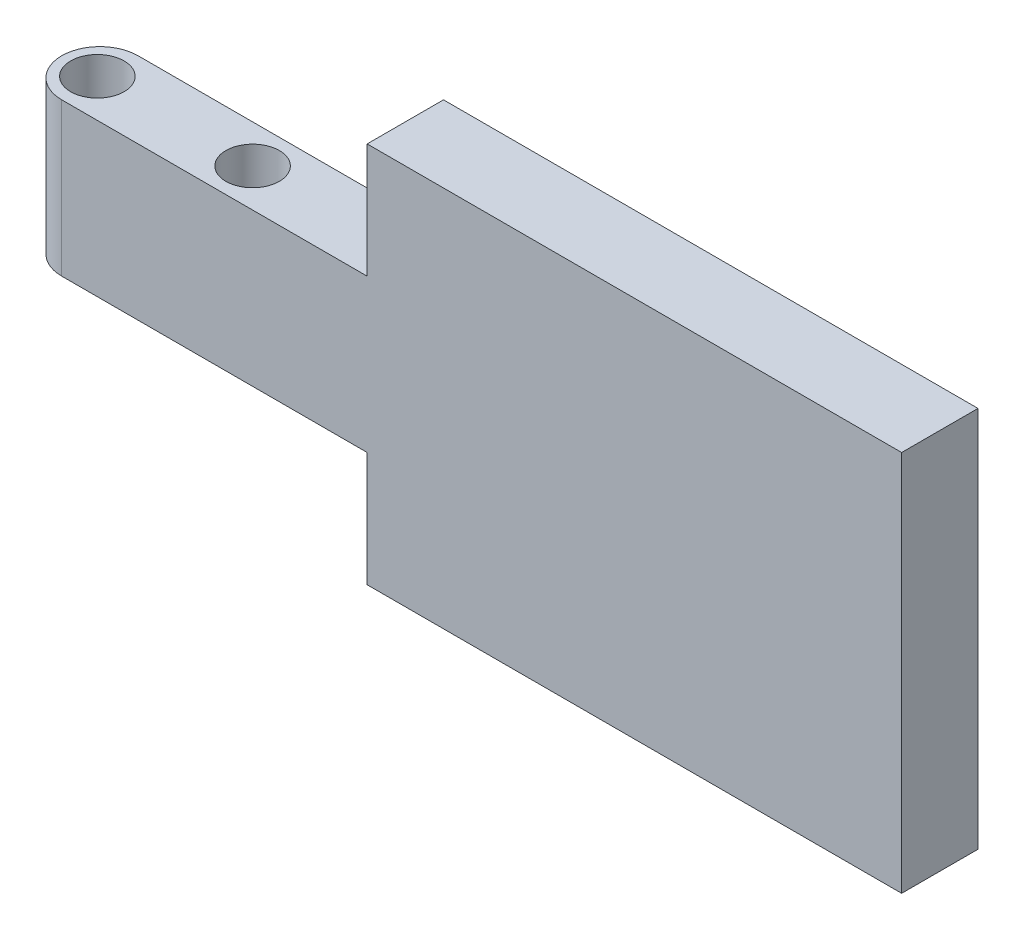
ISO-10303-21;
HEADER;
FILE_DESCRIPTION(('STEP AP214'),'2;1');
FILE_NAME('part.step','',(''),(''),'','','');
FILE_SCHEMA(('AUTOMOTIVE_DESIGN { 1 0 10303 214 1 1 1 1 }'));
ENDSEC;
DATA;
#1=APPLICATION_CONTEXT('core data for automotive mechanical design processes');
#2=APPLICATION_PROTOCOL_DEFINITION('international standard','automotive_design',2000,#1);
#3=PRODUCT_CONTEXT('',#1,'mechanical');
#4=PRODUCT('Part','Part','',(#3));
#5=PRODUCT_RELATED_PRODUCT_CATEGORY('part','',(#4));
#6=PRODUCT_DEFINITION_FORMATION('','',#4);
#7=PRODUCT_DEFINITION_CONTEXT('part definition',#1,'design');
#8=PRODUCT_DEFINITION('design','',#6,#7);
#9=PRODUCT_DEFINITION_SHAPE('','',#8);
#10=(LENGTH_UNIT() NAMED_UNIT(*) SI_UNIT(.MILLI.,.METRE.));
#11=(NAMED_UNIT(*) PLANE_ANGLE_UNIT() SI_UNIT($,.RADIAN.));
#12=(NAMED_UNIT(*) SI_UNIT($,.STERADIAN.) SOLID_ANGLE_UNIT());
#13=UNCERTAINTY_MEASURE_WITH_UNIT(LENGTH_MEASURE(1.E-05),#10,'distance_accuracy_value','');
#14=(GEOMETRIC_REPRESENTATION_CONTEXT(3) GLOBAL_UNCERTAINTY_ASSIGNED_CONTEXT((#13)) GLOBAL_UNIT_ASSIGNED_CONTEXT((#10,
#11,#12)) REPRESENTATION_CONTEXT('',''));
#15=CARTESIAN_POINT('',(0.,0.,0.));
#16=DIRECTION('',(0.,0.,1.));
#17=DIRECTION('',(1.,0.,0.));
#18=AXIS2_PLACEMENT_3D('',#15,#16,#17);
#19=CARTESIAN_POINT('',(-35.,-25.,5.));
#20=DIRECTION('',(1.,0.,0.));
#21=DIRECTION('',(0.,0.,-1.));
#22=AXIS2_PLACEMENT_3D('',#19,#20,#21);
#23=PLANE('',#22);
#24=DIRECTION('',(0.,0.,-1.));
#25=VECTOR('',#24,1.);
#26=CARTESIAN_POINT('',(-35.,10.,-5.));
#27=LINE('',#26,#25);
#28=CARTESIAN_POINT('',(-35.,10.,5.));
#29=VERTEX_POINT('',#28);
#30=CARTESIAN_POINT('',(-35.,10.,-5.));
#31=VERTEX_POINT('',#30);
#32=EDGE_CURVE('E119',#29,#31,#27,.T.);
#33=ORIENTED_EDGE('',*,*,#32,.F.);
#34=DIRECTION('',(0.,1.,0.));
#35=VECTOR('',#34,1.);
#36=CARTESIAN_POINT('',(-35.,-25.,5.));
#37=LINE('',#36,#35);
#38=CARTESIAN_POINT('',(-35.,25.,5.));
#39=VERTEX_POINT('',#38);
#40=EDGE_CURVE('E116',#29,#39,#37,.T.);
#41=ORIENTED_EDGE('',*,*,#40,.T.);
#42=DIRECTION('',(0.,0.,-1.));
#43=VECTOR('',#42,1.);
#44=CARTESIAN_POINT('',(-35.,25.,5.));
#45=LINE('',#44,#43);
#46=CARTESIAN_POINT('',(-35.,25.,-5.));
#47=VERTEX_POINT('',#46);
#48=EDGE_CURVE('E149',#39,#47,#45,.T.);
#49=ORIENTED_EDGE('',*,*,#48,.T.);
#50=DIRECTION('',(0.,1.,0.));
#51=VECTOR('',#50,1.);
#52=CARTESIAN_POINT('',(-35.,-25.,-5.));
#53=LINE('',#52,#51);
#54=EDGE_CURVE('E161',#31,#47,#53,.T.);
#55=ORIENTED_EDGE('',*,*,#54,.F.);
#56=EDGE_LOOP('',(#33,#41,#49,#55));
#57=FACE_BOUND('',#56,.T.);
#58=ADVANCED_FACE('F33',(#57),#23,.F.);
#59=CARTESIAN_POINT('',(-35.,-25.,-5.));
#60=DIRECTION('',(0.,0.,1.));
#61=DIRECTION('',(1.,0.,0.));
#62=AXIS2_PLACEMENT_3D('',#59,#60,#61);
#63=PLANE('',#62);
#64=CARTESIAN_POINT('',(-35.,-25.,-5.));
#65=VERTEX_POINT('',#64);
#66=CARTESIAN_POINT('',(-35.,-10.,-5.));
#67=VERTEX_POINT('',#66);
#68=EDGE_CURVE('E162',#65,#67,#53,.T.);
#69=ORIENTED_EDGE('',*,*,#68,.T.);
#70=DIRECTION('',(-1.,0.,0.));
#71=VECTOR('',#70,1.);
#72=CARTESIAN_POINT('',(-75.,-10.,-5.));
#73=LINE('',#72,#71);
#74=CARTESIAN_POINT('',(-75.,-10.,-5.));
#75=VERTEX_POINT('',#74);
#76=EDGE_CURVE('E50',#67,#75,#73,.T.);
#77=ORIENTED_EDGE('',*,*,#76,.T.);
#78=DIRECTION('',(0.,1.,0.));
#79=VECTOR('',#78,1.);
#80=CARTESIAN_POINT('',(-75.,-10.,-5.));
#81=LINE('',#80,#79);
#82=CARTESIAN_POINT('',(-75.,10.,-5.));
#83=VERTEX_POINT('',#82);
#84=EDGE_CURVE('E110',#75,#83,#81,.T.);
#85=ORIENTED_EDGE('',*,*,#84,.T.);
#86=DIRECTION('',(-1.,0.,0.));
#87=VECTOR('',#86,1.);
#88=CARTESIAN_POINT('',(-75.,10.,-5.));
#89=LINE('',#88,#87);
#90=EDGE_CURVE('E124',#31,#83,#89,.T.);
#91=ORIENTED_EDGE('',*,*,#90,.F.);
#92=ORIENTED_EDGE('',*,*,#54,.T.);
#93=DIRECTION('',(1.,0.,0.));
#94=VECTOR('',#93,1.);
#95=CARTESIAN_POINT('',(-35.,25.,-5.));
#96=LINE('',#95,#94);
#97=CARTESIAN_POINT('',(35.,25.,-5.));
#98=VERTEX_POINT('',#97);
#99=EDGE_CURVE('E139',#47,#98,#96,.T.);
#100=ORIENTED_EDGE('',*,*,#99,.T.);
#101=DIRECTION('',(0.,1.,0.));
#102=VECTOR('',#101,1.);
#103=CARTESIAN_POINT('',(35.,-25.,-5.));
#104=LINE('',#103,#102);
#105=CARTESIAN_POINT('',(35.,-25.,-5.));
#106=VERTEX_POINT('',#105);
#107=EDGE_CURVE('E11',#106,#98,#104,.T.);
#108=ORIENTED_EDGE('',*,*,#107,.F.);
#109=DIRECTION('',(1.,0.,0.));
#110=VECTOR('',#109,1.);
#111=CARTESIAN_POINT('',(-35.,-25.,-5.));
#112=LINE('',#111,#110);
#113=EDGE_CURVE('E152',#65,#106,#112,.T.);
#114=ORIENTED_EDGE('',*,*,#113,.F.);
#115=EDGE_LOOP('',(#69,#77,#85,#91,#92,#100,#108,#114));
#116=FACE_BOUND('',#115,.T.);
#117=ADVANCED_FACE('F35',(#116),#63,.F.);
#118=CARTESIAN_POINT('',(35.,-25.,5.));
#119=DIRECTION('',(1.,0.,0.));
#120=DIRECTION('',(0.,0.,-1.));
#121=AXIS2_PLACEMENT_3D('',#118,#119,#120);
#122=PLANE('',#121);
#123=ORIENTED_EDGE('',*,*,#107,.T.);
#124=DIRECTION('',(0.,0.,-1.));
#125=VECTOR('',#124,1.);
#126=CARTESIAN_POINT('',(35.,25.,5.));
#127=LINE('',#126,#125);
#128=CARTESIAN_POINT('',(35.,25.,5.));
#129=VERTEX_POINT('',#128);
#130=EDGE_CURVE('E143',#129,#98,#127,.T.);
#131=ORIENTED_EDGE('',*,*,#130,.F.);
#132=DIRECTION('',(0.,1.,0.));
#133=VECTOR('',#132,1.);
#134=CARTESIAN_POINT('',(35.,-25.,5.));
#135=LINE('',#134,#133);
#136=CARTESIAN_POINT('',(35.,-25.,5.));
#137=VERTEX_POINT('',#136);
#138=EDGE_CURVE('E42',#137,#129,#135,.T.);
#139=ORIENTED_EDGE('',*,*,#138,.F.);
#140=DIRECTION('',(0.,0.,-1.));
#141=VECTOR('',#140,1.);
#142=CARTESIAN_POINT('',(35.,-25.,5.));
#143=LINE('',#142,#141);
#144=EDGE_CURVE('E154',#137,#106,#143,.T.);
#145=ORIENTED_EDGE('',*,*,#144,.T.);
#146=EDGE_LOOP('',(#123,#131,#139,#145));
#147=FACE_BOUND('',#146,.T.);
#148=ADVANCED_FACE('F199',(#147),#122,.T.);
#149=CARTESIAN_POINT('',(-35.,-25.,5.));
#150=DIRECTION('',(0.,0.,1.));
#151=DIRECTION('',(1.,0.,0.));
#152=AXIS2_PLACEMENT_3D('',#149,#150,#151);
#153=PLANE('',#152);
#154=ORIENTED_EDGE('',*,*,#138,.T.);
#155=DIRECTION('',(1.,0.,0.));
#156=VECTOR('',#155,1.);
#157=CARTESIAN_POINT('',(-35.,25.,5.));
#158=LINE('',#157,#156);
#159=EDGE_CURVE('E146',#39,#129,#158,.T.);
#160=ORIENTED_EDGE('',*,*,#159,.F.);
#161=ORIENTED_EDGE('',*,*,#40,.F.);
#162=DIRECTION('',(1.,0.,0.));
#163=VECTOR('',#162,1.);
#164=CARTESIAN_POINT('',(-35.,10.,5.));
#165=LINE('',#164,#163);
#166=CARTESIAN_POINT('',(-75.,10.,5.));
#167=VERTEX_POINT('',#166);
#168=EDGE_CURVE('E113',#167,#29,#165,.T.);
#169=ORIENTED_EDGE('',*,*,#168,.F.);
#170=DIRECTION('',(0.,1.,0.));
#171=VECTOR('',#170,1.);
#172=CARTESIAN_POINT('',(-75.,-10.,5.));
#173=LINE('',#172,#171);
#174=CARTESIAN_POINT('',(-75.,-10.,5.));
#175=VERTEX_POINT('',#174);
#176=EDGE_CURVE('E101',#175,#167,#173,.T.);
#177=ORIENTED_EDGE('',*,*,#176,.F.);
#178=DIRECTION('',(1.,0.,0.));
#179=VECTOR('',#178,1.);
#180=CARTESIAN_POINT('',(-35.,-10.,5.));
#181=LINE('',#180,#179);
#182=CARTESIAN_POINT('',(-35.,-10.,5.));
#183=VERTEX_POINT('',#182);
#184=EDGE_CURVE('E134',#175,#183,#181,.T.);
#185=ORIENTED_EDGE('',*,*,#184,.T.);
#186=CARTESIAN_POINT('',(-35.,-25.,5.));
#187=VERTEX_POINT('',#186);
#188=EDGE_CURVE('E165',#187,#183,#37,.T.);
#189=ORIENTED_EDGE('',*,*,#188,.F.);
#190=DIRECTION('',(1.,0.,0.));
#191=VECTOR('',#190,1.);
#192=CARTESIAN_POINT('',(-35.,-25.,5.));
#193=LINE('',#192,#191);
#194=EDGE_CURVE('E157',#187,#137,#193,.T.);
#195=ORIENTED_EDGE('',*,*,#194,.T.);
#196=EDGE_LOOP('',(#154,#160,#161,#169,#177,#185,#189,#195));
#197=FACE_BOUND('',#196,.T.);
#198=ADVANCED_FACE('F114',(#197),#153,.T.);
#199=ORIENTED_EDGE('',*,*,#188,.T.);
#200=DIRECTION('',(0.,0.,-1.));
#201=VECTOR('',#200,1.);
#202=CARTESIAN_POINT('',(-35.,-10.,-5.));
#203=LINE('',#202,#201);
#204=EDGE_CURVE('E136',#183,#67,#203,.T.);
#205=ORIENTED_EDGE('',*,*,#204,.T.);
#206=ORIENTED_EDGE('',*,*,#68,.F.);
#207=DIRECTION('',(0.,0.,-1.));
#208=VECTOR('',#207,1.);
#209=CARTESIAN_POINT('',(-35.,-25.,5.));
#210=LINE('',#209,#208);
#211=EDGE_CURVE('E58',#187,#65,#210,.T.);
#212=ORIENTED_EDGE('',*,*,#211,.F.);
#213=EDGE_LOOP('',(#199,#205,#206,#212));
#214=FACE_BOUND('',#213,.T.);
#215=ADVANCED_FACE('F195',(#214),#23,.F.);
#216=CARTESIAN_POINT('',(0.,-25.,0.));
#217=DIRECTION('',(0.,1.,0.));
#218=DIRECTION('',(0.,0.,1.));
#219=AXIS2_PLACEMENT_3D('',#216,#217,#218);
#220=PLANE('',#219);
#221=ORIENTED_EDGE('',*,*,#113,.T.);
#222=ORIENTED_EDGE('',*,*,#144,.F.);
#223=ORIENTED_EDGE('',*,*,#194,.F.);
#224=ORIENTED_EDGE('',*,*,#211,.T.);
#225=EDGE_LOOP('',(#221,#222,#223,#224));
#226=FACE_BOUND('',#225,.T.);
#227=ADVANCED_FACE('F197',(#226),#220,.F.);
#228=CARTESIAN_POINT('',(0.,25.,0.));
#229=DIRECTION('',(0.,1.,0.));
#230=DIRECTION('',(0.,0.,1.));
#231=AXIS2_PLACEMENT_3D('',#228,#229,#230);
#232=PLANE('',#231);
#233=ORIENTED_EDGE('',*,*,#99,.F.);
#234=ORIENTED_EDGE('',*,*,#48,.F.);
#235=ORIENTED_EDGE('',*,*,#159,.T.);
#236=ORIENTED_EDGE('',*,*,#130,.T.);
#237=EDGE_LOOP('',(#233,#234,#235,#236));
#238=FACE_BOUND('',#237,.T.);
#239=ADVANCED_FACE('F203',(#238),#232,.T.);
#240=CARTESIAN_POINT('',(-75.,-10.,0.));
#241=DIRECTION('',(0.,1.,0.));
#242=DIRECTION('',(0.,0.,1.));
#243=AXIS2_PLACEMENT_3D('',#240,#241,#242);
#244=CYLINDRICAL_SURFACE('',#243,5.);
#245=ORIENTED_EDGE('',*,*,#176,.T.);
#246=CARTESIAN_POINT('',(-75.,10.,0.));
#247=DIRECTION('',(0.,1.,0.));
#248=DIRECTION('',(0.,0.,1.));
#249=AXIS2_PLACEMENT_3D('',#246,#247,#248);
#250=CIRCLE('',#249,5.);
#251=EDGE_CURVE('E105',#83,#167,#250,.T.);
#252=ORIENTED_EDGE('',*,*,#251,.F.);
#253=ORIENTED_EDGE('',*,*,#84,.F.);
#254=CARTESIAN_POINT('',(-75.,-10.,0.));
#255=DIRECTION('',(0.,1.,0.));
#256=DIRECTION('',(0.,0.,1.));
#257=AXIS2_PLACEMENT_3D('',#254,#255,#256);
#258=CIRCLE('',#257,5.);
#259=EDGE_CURVE('E106',#75,#175,#258,.T.);
#260=ORIENTED_EDGE('',*,*,#259,.T.);
#261=EDGE_LOOP('',(#245,#252,#253,#260));
#262=FACE_BOUND('',#261,.T.);
#263=ADVANCED_FACE('F103',(#262),#244,.T.);
#264=CARTESIAN_POINT('',(-75.,-10.,0.));
#265=DIRECTION('',(0.,1.,0.));
#266=DIRECTION('',(0.,0.,1.));
#267=AXIS2_PLACEMENT_3D('',#264,#265,#266);
#268=PLANE('',#267);
#269=CARTESIAN_POINT('',(-75.3331770971365,-10.,0.));
#270=DIRECTION('',(0.,1.,0.));
#271=DIRECTION('',(0.,0.,1.));
#272=AXIS2_PLACEMENT_3D('',#269,#270,#271);
#273=CIRCLE('',#272,3.50000000000001);
#274=CARTESIAN_POINT('',(-75.3331770971365,-10.,3.50000000000001));
#275=VERTEX_POINT('',#274);
#276=EDGE_CURVE('E125',#275,#275,#273,.F.);
#277=ORIENTED_EDGE('',*,*,#276,.F.);
#278=EDGE_LOOP('',(#277));
#279=FACE_BOUND('',#278,.T.);
#280=CARTESIAN_POINT('',(-55.,-10.,0.));
#281=DIRECTION('',(0.,1.,0.));
#282=DIRECTION('',(0.,0.,1.));
#283=AXIS2_PLACEMENT_3D('',#280,#281,#282);
#284=CIRCLE('',#283,3.5);
#285=CARTESIAN_POINT('',(-55.,-10.,3.5));
#286=VERTEX_POINT('',#285);
#287=EDGE_CURVE('E170',#286,#286,#284,.F.);
#288=ORIENTED_EDGE('',*,*,#287,.F.);
#289=EDGE_LOOP('',(#288));
#290=FACE_BOUND('',#289,.T.);
#291=ORIENTED_EDGE('',*,*,#259,.F.);
#292=ORIENTED_EDGE('',*,*,#76,.F.);
#293=ORIENTED_EDGE('',*,*,#204,.F.);
#294=ORIENTED_EDGE('',*,*,#184,.F.);
#295=EDGE_LOOP('',(#291,#292,#293,#294));
#296=FACE_BOUND('',#295,.T.);
#297=ADVANCED_FACE('F187',(#279,#290,#296),#268,.F.);
#298=CARTESIAN_POINT('',(-75.,10.,0.));
#299=DIRECTION('',(0.,1.,0.));
#300=DIRECTION('',(0.,0.,1.));
#301=AXIS2_PLACEMENT_3D('',#298,#299,#300);
#302=PLANE('',#301);
#303=CARTESIAN_POINT('',(-75.3331770971365,10.,0.));
#304=DIRECTION('',(0.,1.,0.));
#305=DIRECTION('',(0.,0.,1.));
#306=AXIS2_PLACEMENT_3D('',#303,#304,#305);
#307=CIRCLE('',#306,3.50000000000001);
#308=CARTESIAN_POINT('',(-75.3331770971365,10.,3.50000000000001));
#309=VERTEX_POINT('',#308);
#310=EDGE_CURVE('E37',#309,#309,#307,.F.);
#311=ORIENTED_EDGE('',*,*,#310,.T.);
#312=EDGE_LOOP('',(#311));
#313=FACE_BOUND('',#312,.T.);
#314=CARTESIAN_POINT('',(-55.,10.,0.));
#315=DIRECTION('',(0.,1.,0.));
#316=DIRECTION('',(0.,0.,1.));
#317=AXIS2_PLACEMENT_3D('',#314,#315,#316);
#318=CIRCLE('',#317,3.5);
#319=CARTESIAN_POINT('',(-55.,10.,3.5));
#320=VERTEX_POINT('',#319);
#321=EDGE_CURVE('E168',#320,#320,#318,.F.);
#322=ORIENTED_EDGE('',*,*,#321,.T.);
#323=EDGE_LOOP('',(#322));
#324=FACE_BOUND('',#323,.T.);
#325=ORIENTED_EDGE('',*,*,#251,.T.);
#326=ORIENTED_EDGE('',*,*,#168,.T.);
#327=ORIENTED_EDGE('',*,*,#32,.T.);
#328=ORIENTED_EDGE('',*,*,#90,.T.);
#329=EDGE_LOOP('',(#325,#326,#327,#328));
#330=FACE_BOUND('',#329,.T.);
#331=ADVANCED_FACE('F122',(#313,#324,#330),#302,.T.);
#332=CARTESIAN_POINT('',(-55.,19.,0.));
#333=DIRECTION('',(0.,-1.,0.));
#334=DIRECTION('',(0.,0.,-1.));
#335=AXIS2_PLACEMENT_3D('',#332,#333,#334);
#336=CYLINDRICAL_SURFACE('',#335,3.5);
#337=ORIENTED_EDGE('',*,*,#321,.F.);
#338=EDGE_LOOP('',(#337));
#339=FACE_BOUND('',#338,.T.);
#340=ORIENTED_EDGE('',*,*,#287,.T.);
#341=EDGE_LOOP('',(#340));
#342=FACE_BOUND('',#341,.T.);
#343=ADVANCED_FACE('F183',(#339,#342),#336,.F.);
#344=CARTESIAN_POINT('',(-75.3331770971365,19.,0.));
#345=DIRECTION('',(0.,-1.,0.));
#346=DIRECTION('',(0.,0.,-1.));
#347=AXIS2_PLACEMENT_3D('',#344,#345,#346);
#348=CYLINDRICAL_SURFACE('',#347,3.50000000000001);
#349=ORIENTED_EDGE('',*,*,#310,.F.);
#350=EDGE_LOOP('',(#349));
#351=FACE_BOUND('',#350,.T.);
#352=ORIENTED_EDGE('',*,*,#276,.T.);
#353=EDGE_LOOP('',(#352));
#354=FACE_BOUND('',#353,.T.);
#355=ADVANCED_FACE('F180',(#351,#354),#348,.F.);
#356=CLOSED_SHELL('',(#58,#117,#148,#198,#215,#227,#239,#263,#297,#331,#343,#355));
#357=MANIFOLD_SOLID_BREP('B2',#356);
#358=ADVANCED_BREP_SHAPE_REPRESENTATION('',(#18,#357),#14);
#359=SHAPE_DEFINITION_REPRESENTATION(#9,#358);
ENDSEC;
END-ISO-10303-21;
